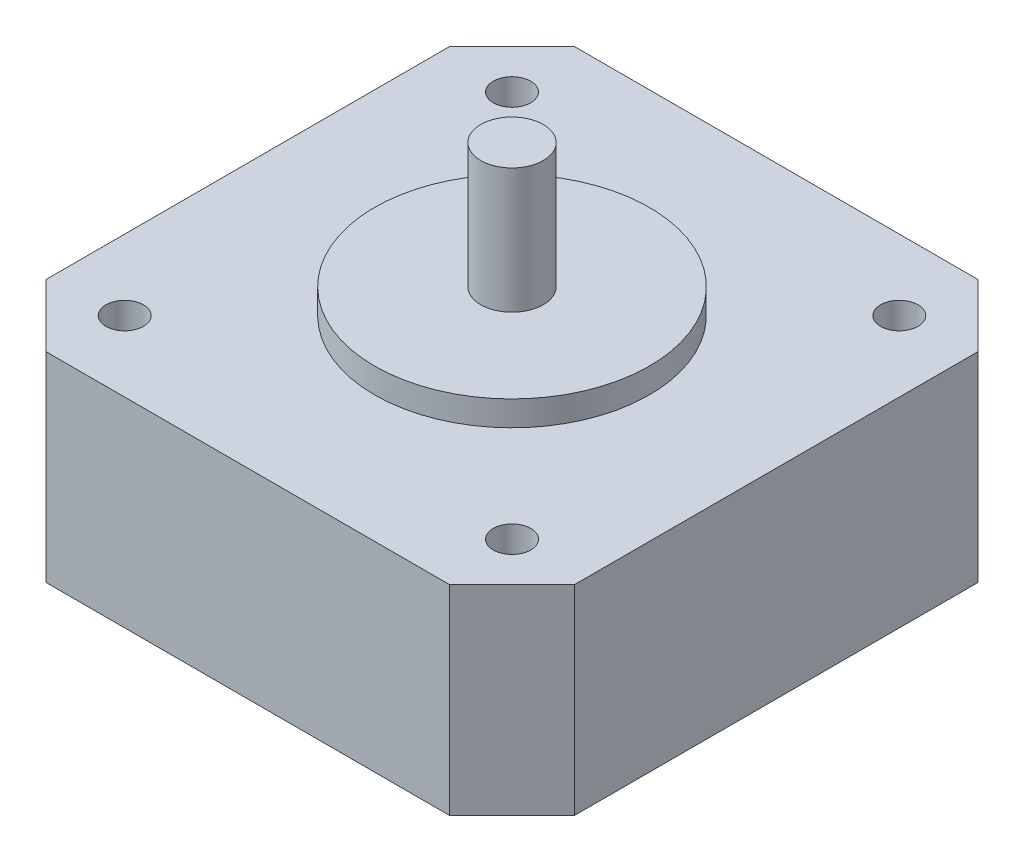
ISO-10303-21;
HEADER;
FILE_DESCRIPTION(('STEP AP214'),'2;1');
FILE_NAME('part.step','',(''),(''),'','','');
FILE_SCHEMA(('AUTOMOTIVE_DESIGN { 1 0 10303 214 1 1 1 1 }'));
ENDSEC;
DATA;
#1=APPLICATION_CONTEXT('core data for automotive mechanical design processes');
#2=APPLICATION_PROTOCOL_DEFINITION('international standard','automotive_design',2000,#1);
#3=PRODUCT_CONTEXT('',#1,'mechanical');
#4=PRODUCT('Part','Part','',(#3));
#5=PRODUCT_RELATED_PRODUCT_CATEGORY('part','',(#4));
#6=PRODUCT_DEFINITION_FORMATION('','',#4);
#7=PRODUCT_DEFINITION_CONTEXT('part definition',#1,'design');
#8=PRODUCT_DEFINITION('design','',#6,#7);
#9=PRODUCT_DEFINITION_SHAPE('','',#8);
#10=(LENGTH_UNIT() NAMED_UNIT(*) SI_UNIT(.MILLI.,.METRE.));
#11=(NAMED_UNIT(*) PLANE_ANGLE_UNIT() SI_UNIT($,.RADIAN.));
#12=(NAMED_UNIT(*) SI_UNIT($,.STERADIAN.) SOLID_ANGLE_UNIT());
#13=UNCERTAINTY_MEASURE_WITH_UNIT(LENGTH_MEASURE(1.E-05),#10,'distance_accuracy_value','');
#14=(GEOMETRIC_REPRESENTATION_CONTEXT(3) GLOBAL_UNCERTAINTY_ASSIGNED_CONTEXT((#13)) GLOBAL_UNIT_ASSIGNED_CONTEXT((#10,
#11,#12)) REPRESENTATION_CONTEXT('',''));
#15=CARTESIAN_POINT('',(0.,0.,0.));
#16=DIRECTION('',(0.,0.,1.));
#17=DIRECTION('',(1.,0.,0.));
#18=AXIS2_PLACEMENT_3D('',#15,#16,#17);
#19=CARTESIAN_POINT('',(-21.15,-45.9,-21.15));
#20=DIRECTION('',(0.,0.,-1.));
#21=DIRECTION('',(-1.,0.,0.));
#22=AXIS2_PLACEMENT_3D('',#19,#20,#21);
#23=PLANE('',#22);
#24=DIRECTION('',(1.,0.,0.));
#25=VECTOR('',#24,1.);
#26=CARTESIAN_POINT('',(-21.15,-61.9,-21.15));
#27=LINE('',#26,#25);
#28=CARTESIAN_POINT('',(-16.15,-61.9,-21.15));
#29=VERTEX_POINT('',#28);
#30=CARTESIAN_POINT('',(16.1500000000001,-61.9,-21.15));
#31=VERTEX_POINT('',#30);
#32=EDGE_CURVE('E178',#29,#31,#27,.T.);
#33=ORIENTED_EDGE('',*,*,#32,.F.);
#34=DIRECTION('',(0.,1.,0.));
#35=VECTOR('',#34,1.);
#36=CARTESIAN_POINT('',(-16.15,-45.9,-21.15));
#37=LINE('',#36,#35);
#38=CARTESIAN_POINT('',(-16.15,-45.9,-21.15));
#39=VERTEX_POINT('',#38);
#40=EDGE_CURVE('E43',#29,#39,#37,.T.);
#41=ORIENTED_EDGE('',*,*,#40,.T.);
#42=DIRECTION('',(1.,0.,0.));
#43=VECTOR('',#42,1.);
#44=CARTESIAN_POINT('',(-21.15,-45.9,-21.15));
#45=LINE('',#44,#43);
#46=CARTESIAN_POINT('',(16.1500000000001,-45.9,-21.15));
#47=VERTEX_POINT('',#46);
#48=EDGE_CURVE('E173',#39,#47,#45,.T.);
#49=ORIENTED_EDGE('',*,*,#48,.T.);
#50=DIRECTION('',(0.,-1.,0.));
#51=VECTOR('',#50,1.);
#52=CARTESIAN_POINT('',(16.1500000000001,-45.9,-21.15));
#53=LINE('',#52,#51);
#54=EDGE_CURVE('E156',#47,#31,#53,.T.);
#55=ORIENTED_EDGE('',*,*,#54,.T.);
#56=EDGE_LOOP('',(#33,#41,#49,#55));
#57=FACE_BOUND('',#56,.T.);
#58=ADVANCED_FACE('F38',(#57),#23,.T.);
#59=CARTESIAN_POINT('',(-21.15,-45.9,21.15));
#60=DIRECTION('',(-1.,0.,0.));
#61=DIRECTION('',(0.,0.,1.));
#62=AXIS2_PLACEMENT_3D('',#59,#60,#61);
#63=PLANE('',#62);
#64=DIRECTION('',(0.,0.,-1.));
#65=VECTOR('',#64,1.);
#66=CARTESIAN_POINT('',(-21.15,-61.9,21.15));
#67=LINE('',#66,#65);
#68=CARTESIAN_POINT('',(-21.15,-61.9,16.15));
#69=VERTEX_POINT('',#68);
#70=CARTESIAN_POINT('',(-21.15,-61.9,-16.1500000000001));
#71=VERTEX_POINT('',#70);
#72=EDGE_CURVE('E127',#69,#71,#67,.T.);
#73=ORIENTED_EDGE('',*,*,#72,.F.);
#74=DIRECTION('',(0.,1.,0.));
#75=VECTOR('',#74,1.);
#76=CARTESIAN_POINT('',(-21.15,-45.9,16.15));
#77=LINE('',#76,#75);
#78=CARTESIAN_POINT('',(-21.15,-45.9,16.15));
#79=VERTEX_POINT('',#78);
#80=EDGE_CURVE('E145',#69,#79,#77,.T.);
#81=ORIENTED_EDGE('',*,*,#80,.T.);
#82=DIRECTION('',(0.,0.,-1.));
#83=VECTOR('',#82,1.);
#84=CARTESIAN_POINT('',(-21.15,-45.9,21.15));
#85=LINE('',#84,#83);
#86=CARTESIAN_POINT('',(-21.15,-45.9,-16.1500000000001));
#87=VERTEX_POINT('',#86);
#88=EDGE_CURVE('E130',#79,#87,#85,.T.);
#89=ORIENTED_EDGE('',*,*,#88,.T.);
#90=DIRECTION('',(0.,-1.,0.));
#91=VECTOR('',#90,1.);
#92=CARTESIAN_POINT('',(-21.15,-45.9,-16.1500000000001));
#93=LINE('',#92,#91);
#94=EDGE_CURVE('E142',#87,#71,#93,.T.);
#95=ORIENTED_EDGE('',*,*,#94,.T.);
#96=EDGE_LOOP('',(#73,#81,#89,#95));
#97=FACE_BOUND('',#96,.T.);
#98=ADVANCED_FACE('F237',(#97),#63,.T.);
#99=CARTESIAN_POINT('',(21.15,-45.9,21.15));
#100=DIRECTION('',(0.,0.,1.));
#101=DIRECTION('',(1.,0.,0.));
#102=AXIS2_PLACEMENT_3D('',#99,#100,#101);
#103=PLANE('',#102);
#104=DIRECTION('',(-1.,0.,0.));
#105=VECTOR('',#104,1.);
#106=CARTESIAN_POINT('',(21.15,-45.9,21.15));
#107=LINE('',#106,#105);
#108=CARTESIAN_POINT('',(16.15,-45.9,21.15));
#109=VERTEX_POINT('',#108);
#110=CARTESIAN_POINT('',(-16.1500000000001,-45.9,21.15));
#111=VERTEX_POINT('',#110);
#112=EDGE_CURVE('E135',#109,#111,#107,.T.);
#113=ORIENTED_EDGE('',*,*,#112,.T.);
#114=DIRECTION('',(0.,-1.,0.));
#115=VECTOR('',#114,1.);
#116=CARTESIAN_POINT('',(-16.1500000000001,-45.9,21.15));
#117=LINE('',#116,#115);
#118=CARTESIAN_POINT('',(-16.1500000000001,-61.9,21.15));
#119=VERTEX_POINT('',#118);
#120=EDGE_CURVE('E126',#111,#119,#117,.T.);
#121=ORIENTED_EDGE('',*,*,#120,.T.);
#122=DIRECTION('',(-1.,0.,0.));
#123=VECTOR('',#122,1.);
#124=CARTESIAN_POINT('',(21.15,-61.9,21.15));
#125=LINE('',#124,#123);
#126=CARTESIAN_POINT('',(16.15,-61.9,21.15));
#127=VERTEX_POINT('',#126);
#128=EDGE_CURVE('E111',#127,#119,#125,.T.);
#129=ORIENTED_EDGE('',*,*,#128,.F.);
#130=DIRECTION('',(0.,1.,0.));
#131=VECTOR('',#130,1.);
#132=CARTESIAN_POINT('',(16.15,-45.9,21.15));
#133=LINE('',#132,#131);
#134=EDGE_CURVE('E124',#127,#109,#133,.T.);
#135=ORIENTED_EDGE('',*,*,#134,.T.);
#136=EDGE_LOOP('',(#113,#121,#129,#135));
#137=FACE_BOUND('',#136,.T.);
#138=ADVANCED_FACE('F123',(#137),#103,.T.);
#139=CARTESIAN_POINT('',(21.15,-45.9,-21.15));
#140=DIRECTION('',(1.,0.,0.));
#141=DIRECTION('',(0.,0.,-1.));
#142=AXIS2_PLACEMENT_3D('',#139,#140,#141);
#143=PLANE('',#142);
#144=DIRECTION('',(0.,0.,1.));
#145=VECTOR('',#144,1.);
#146=CARTESIAN_POINT('',(21.15,-45.9,-21.15));
#147=LINE('',#146,#145);
#148=CARTESIAN_POINT('',(21.15,-45.9,-16.15));
#149=VERTEX_POINT('',#148);
#150=CARTESIAN_POINT('',(21.15,-45.9,16.1500000000001));
#151=VERTEX_POINT('',#150);
#152=EDGE_CURVE('E175',#149,#151,#147,.T.);
#153=ORIENTED_EDGE('',*,*,#152,.T.);
#154=DIRECTION('',(0.,-1.,0.));
#155=VECTOR('',#154,1.);
#156=CARTESIAN_POINT('',(21.15,-45.9,16.1500000000001));
#157=LINE('',#156,#155);
#158=CARTESIAN_POINT('',(21.15,-61.9,16.1500000000001));
#159=VERTEX_POINT('',#158);
#160=EDGE_CURVE('E155',#151,#159,#157,.T.);
#161=ORIENTED_EDGE('',*,*,#160,.T.);
#162=DIRECTION('',(0.,0.,1.));
#163=VECTOR('',#162,1.);
#164=CARTESIAN_POINT('',(21.15,-61.9,-21.15));
#165=LINE('',#164,#163);
#166=CARTESIAN_POINT('',(21.15,-61.9,-16.15));
#167=VERTEX_POINT('',#166);
#168=EDGE_CURVE('E112',#167,#159,#165,.T.);
#169=ORIENTED_EDGE('',*,*,#168,.F.);
#170=DIRECTION('',(0.,1.,0.));
#171=VECTOR('',#170,1.);
#172=CARTESIAN_POINT('',(21.15,-45.9,-16.15));
#173=LINE('',#172,#171);
#174=EDGE_CURVE('E63',#167,#149,#173,.T.);
#175=ORIENTED_EDGE('',*,*,#174,.T.);
#176=EDGE_LOOP('',(#153,#161,#169,#175));
#177=FACE_BOUND('',#176,.T.);
#178=ADVANCED_FACE('F246',(#177),#143,.T.);
#179=CARTESIAN_POINT('',(0.,-45.9,0.));
#180=DIRECTION('',(0.,-1.,0.));
#181=DIRECTION('',(0.,0.,-1.));
#182=AXIS2_PLACEMENT_3D('',#179,#180,#181);
#183=PLANE('',#182);
#184=CARTESIAN_POINT('',(15.5,-45.9,-15.5));
#185=DIRECTION('',(0.,1.,0.));
#186=DIRECTION('',(0.,0.,1.));
#187=AXIS2_PLACEMENT_3D('',#184,#185,#186);
#188=CIRCLE('',#187,1.5);
#189=CARTESIAN_POINT('',(15.5,-45.9,-14.));
#190=VERTEX_POINT('',#189);
#191=EDGE_CURVE('E192',#190,#190,#188,.T.);
#192=ORIENTED_EDGE('',*,*,#191,.F.);
#193=EDGE_LOOP('',(#192));
#194=FACE_BOUND('',#193,.T.);
#195=CARTESIAN_POINT('',(15.5,-45.9,15.5));
#196=DIRECTION('',(0.,1.,0.));
#197=DIRECTION('',(0.,0.,1.));
#198=AXIS2_PLACEMENT_3D('',#195,#196,#197);
#199=CIRCLE('',#198,1.5);
#200=CARTESIAN_POINT('',(15.5,-45.9,17.));
#201=VERTEX_POINT('',#200);
#202=EDGE_CURVE('E199',#201,#201,#199,.T.);
#203=ORIENTED_EDGE('',*,*,#202,.F.);
#204=EDGE_LOOP('',(#203));
#205=FACE_BOUND('',#204,.T.);
#206=CARTESIAN_POINT('',(-15.5,-45.9,15.5));
#207=DIRECTION('',(0.,1.,0.));
#208=DIRECTION('',(0.,0.,1.));
#209=AXIS2_PLACEMENT_3D('',#206,#207,#208);
#210=CIRCLE('',#209,1.5);
#211=CARTESIAN_POINT('',(-15.5,-45.9,17.));
#212=VERTEX_POINT('',#211);
#213=EDGE_CURVE('E205',#212,#212,#210,.T.);
#214=ORIENTED_EDGE('',*,*,#213,.F.);
#215=EDGE_LOOP('',(#214));
#216=FACE_BOUND('',#215,.T.);
#217=CARTESIAN_POINT('',(-15.5,-45.9,-15.5));
#218=DIRECTION('',(0.,1.,0.));
#219=DIRECTION('',(0.,0.,1.));
#220=AXIS2_PLACEMENT_3D('',#217,#218,#219);
#221=CIRCLE('',#220,1.5);
#222=CARTESIAN_POINT('',(-15.5,-45.9,-14.));
#223=VERTEX_POINT('',#222);
#224=EDGE_CURVE('E185',#223,#223,#221,.T.);
#225=ORIENTED_EDGE('',*,*,#224,.F.);
#226=EDGE_LOOP('',(#225));
#227=FACE_BOUND('',#226,.T.);
#228=CARTESIAN_POINT('',(0.,-45.9,0.));
#229=DIRECTION('',(0.,1.,0.));
#230=DIRECTION('',(0.,0.,1.));
#231=AXIS2_PLACEMENT_3D('',#228,#229,#230);
#232=CIRCLE('',#231,11.);
#233=CARTESIAN_POINT('',(0.,-45.9,11.));
#234=VERTEX_POINT('',#233);
#235=EDGE_CURVE('E48',#234,#234,#232,.T.);
#236=ORIENTED_EDGE('',*,*,#235,.F.);
#237=EDGE_LOOP('',(#236));
#238=FACE_BOUND('',#237,.T.);
#239=ORIENTED_EDGE('',*,*,#88,.F.);
#240=DIRECTION('',(-0.707106781186543,0.,-0.707106781186552));
#241=VECTOR('',#240,1.);
#242=CARTESIAN_POINT('',(-16.1500000000001,-45.9,21.15));
#243=LINE('',#242,#241);
#244=EDGE_CURVE('E152',#79,#111,#243,.F.);
#245=ORIENTED_EDGE('',*,*,#244,.T.);
#246=ORIENTED_EDGE('',*,*,#112,.F.);
#247=DIRECTION('',(-0.707106781186552,0.,0.707106781186543));
#248=VECTOR('',#247,1.);
#249=CARTESIAN_POINT('',(21.15,-45.9,16.1500000000001));
#250=LINE('',#249,#248);
#251=EDGE_CURVE('E56',#109,#151,#250,.F.);
#252=ORIENTED_EDGE('',*,*,#251,.T.);
#253=ORIENTED_EDGE('',*,*,#152,.F.);
#254=DIRECTION('',(0.707106781186543,0.,0.707106781186552));
#255=VECTOR('',#254,1.);
#256=CARTESIAN_POINT('',(16.1500000000001,-45.9,-21.15));
#257=LINE('',#256,#255);
#258=EDGE_CURVE('E147',#149,#47,#257,.F.);
#259=ORIENTED_EDGE('',*,*,#258,.T.);
#260=ORIENTED_EDGE('',*,*,#48,.F.);
#261=DIRECTION('',(0.707106781186552,0.,-0.707106781186543));
#262=VECTOR('',#261,1.);
#263=CARTESIAN_POINT('',(-21.15,-45.9,-16.1500000000001));
#264=LINE('',#263,#262);
#265=EDGE_CURVE('E149',#39,#87,#264,.F.);
#266=ORIENTED_EDGE('',*,*,#265,.T.);
#267=EDGE_LOOP('',(#239,#245,#246,#252,#253,#259,#260,#266));
#268=FACE_BOUND('',#267,.T.);
#269=ADVANCED_FACE('F272',(#194,#205,#216,#227,#238,#268),#183,.F.);
#270=CARTESIAN_POINT('',(0.,-61.9,0.));
#271=DIRECTION('',(0.,-1.,0.));
#272=DIRECTION('',(0.,0.,-1.));
#273=AXIS2_PLACEMENT_3D('',#270,#271,#272);
#274=PLANE('',#273);
#275=ORIENTED_EDGE('',*,*,#128,.T.);
#276=DIRECTION('',(0.707106781186543,0.,0.707106781186552));
#277=VECTOR('',#276,1.);
#278=CARTESIAN_POINT('',(-18.6500000000001,-61.9,18.6499999999999));
#279=LINE('',#278,#277);
#280=EDGE_CURVE('E117',#119,#69,#279,.F.);
#281=ORIENTED_EDGE('',*,*,#280,.T.);
#282=ORIENTED_EDGE('',*,*,#72,.T.);
#283=DIRECTION('',(-0.707106781186552,0.,0.707106781186543));
#284=VECTOR('',#283,1.);
#285=CARTESIAN_POINT('',(-18.6499999999999,-61.9,-18.6500000000001));
#286=LINE('',#285,#284);
#287=EDGE_CURVE('E118',#71,#29,#286,.F.);
#288=ORIENTED_EDGE('',*,*,#287,.T.);
#289=ORIENTED_EDGE('',*,*,#32,.T.);
#290=DIRECTION('',(-0.707106781186543,0.,-0.707106781186552));
#291=VECTOR('',#290,1.);
#292=CARTESIAN_POINT('',(18.6500000000001,-61.9,-18.6499999999999));
#293=LINE('',#292,#291);
#294=EDGE_CURVE('E132',#31,#167,#293,.F.);
#295=ORIENTED_EDGE('',*,*,#294,.T.);
#296=ORIENTED_EDGE('',*,*,#168,.T.);
#297=DIRECTION('',(0.707106781186552,0.,-0.707106781186543));
#298=VECTOR('',#297,1.);
#299=CARTESIAN_POINT('',(18.6499999999999,-61.9,18.6500000000001));
#300=LINE('',#299,#298);
#301=EDGE_CURVE('E108',#159,#127,#300,.F.);
#302=ORIENTED_EDGE('',*,*,#301,.T.);
#303=EDGE_LOOP('',(#275,#281,#282,#288,#289,#295,#296,#302));
#304=FACE_BOUND('',#303,.T.);
#305=ADVANCED_FACE('F110',(#304),#274,.T.);
#306=CARTESIAN_POINT('',(-16.1500000000001,-45.9,21.15));
#307=DIRECTION('',(0.707106781186552,0.,-0.707106781186543));
#308=DIRECTION('',(0.,-1.,0.));
#309=AXIS2_PLACEMENT_3D('',#306,#307,#308);
#310=PLANE('',#309);
#311=ORIENTED_EDGE('',*,*,#244,.F.);
#312=ORIENTED_EDGE('',*,*,#80,.F.);
#313=ORIENTED_EDGE('',*,*,#280,.F.);
#314=ORIENTED_EDGE('',*,*,#120,.F.);
#315=EDGE_LOOP('',(#311,#312,#313,#314));
#316=FACE_BOUND('',#315,.T.);
#317=ADVANCED_FACE('F249',(#316),#310,.F.);
#318=CARTESIAN_POINT('',(21.15,-45.9,16.1500000000001));
#319=DIRECTION('',(-0.707106781186543,0.,-0.707106781186552));
#320=DIRECTION('',(0.,-1.,0.));
#321=AXIS2_PLACEMENT_3D('',#318,#319,#320);
#322=PLANE('',#321);
#323=ORIENTED_EDGE('',*,*,#251,.F.);
#324=ORIENTED_EDGE('',*,*,#134,.F.);
#325=ORIENTED_EDGE('',*,*,#301,.F.);
#326=ORIENTED_EDGE('',*,*,#160,.F.);
#327=EDGE_LOOP('',(#323,#324,#325,#326));
#328=FACE_BOUND('',#327,.T.);
#329=ADVANCED_FACE('F129',(#328),#322,.F.);
#330=CARTESIAN_POINT('',(-21.15,-45.9,-16.1500000000001));
#331=DIRECTION('',(0.707106781186543,0.,0.707106781186552));
#332=DIRECTION('',(0.,-1.,0.));
#333=AXIS2_PLACEMENT_3D('',#330,#331,#332);
#334=PLANE('',#333);
#335=ORIENTED_EDGE('',*,*,#265,.F.);
#336=ORIENTED_EDGE('',*,*,#40,.F.);
#337=ORIENTED_EDGE('',*,*,#287,.F.);
#338=ORIENTED_EDGE('',*,*,#94,.F.);
#339=EDGE_LOOP('',(#335,#336,#337,#338));
#340=FACE_BOUND('',#339,.T.);
#341=ADVANCED_FACE('F260',(#340),#334,.F.);
#342=CARTESIAN_POINT('',(16.1500000000001,-45.9,-21.15));
#343=DIRECTION('',(-0.707106781186552,0.,0.707106781186543));
#344=DIRECTION('',(0.,-1.,0.));
#345=AXIS2_PLACEMENT_3D('',#342,#343,#344);
#346=PLANE('',#345);
#347=ORIENTED_EDGE('',*,*,#258,.F.);
#348=ORIENTED_EDGE('',*,*,#174,.F.);
#349=ORIENTED_EDGE('',*,*,#294,.F.);
#350=ORIENTED_EDGE('',*,*,#54,.F.);
#351=EDGE_LOOP('',(#347,#348,#349,#350));
#352=FACE_BOUND('',#351,.T.);
#353=ADVANCED_FACE('F41',(#352),#346,.F.);
#354=CARTESIAN_POINT('',(0.,-43.9,0.));
#355=DIRECTION('',(0.,-1.,0.));
#356=DIRECTION('',(0.,0.,-1.));
#357=AXIS2_PLACEMENT_3D('',#354,#355,#356);
#358=CYLINDRICAL_SURFACE('',#357,11.);
#359=CARTESIAN_POINT('',(0.,-43.9,0.));
#360=DIRECTION('',(0.,1.,0.));
#361=DIRECTION('',(0.,0.,1.));
#362=AXIS2_PLACEMENT_3D('',#359,#360,#361);
#363=CIRCLE('',#362,11.);
#364=CARTESIAN_POINT('',(0.,-43.9,11.));
#365=VERTEX_POINT('',#364);
#366=EDGE_CURVE('E171',#365,#365,#363,.T.);
#367=ORIENTED_EDGE('',*,*,#366,.F.);
#368=EDGE_LOOP('',(#367));
#369=FACE_BOUND('',#368,.T.);
#370=ORIENTED_EDGE('',*,*,#235,.T.);
#371=EDGE_LOOP('',(#370));
#372=FACE_BOUND('',#371,.T.);
#373=ADVANCED_FACE('F225',(#369,#372),#358,.T.);
#374=CARTESIAN_POINT('',(0.,-43.9,0.));
#375=DIRECTION('',(0.,1.,0.));
#376=DIRECTION('',(0.,0.,1.));
#377=AXIS2_PLACEMENT_3D('',#374,#375,#376);
#378=PLANE('',#377);
#379=CARTESIAN_POINT('',(0.,-43.9,0.));
#380=DIRECTION('',(0.,1.,0.));
#381=DIRECTION('',(0.,0.,1.));
#382=AXIS2_PLACEMENT_3D('',#379,#380,#381);
#383=CIRCLE('',#382,2.5);
#384=CARTESIAN_POINT('',(0.,-43.9,2.5));
#385=VERTEX_POINT('',#384);
#386=EDGE_CURVE('E11',#385,#385,#383,.T.);
#387=ORIENTED_EDGE('',*,*,#386,.F.);
#388=EDGE_LOOP('',(#387));
#389=FACE_BOUND('',#388,.T.);
#390=ORIENTED_EDGE('',*,*,#366,.T.);
#391=EDGE_LOOP('',(#390));
#392=FACE_BOUND('',#391,.T.);
#393=ADVANCED_FACE('F222',(#389,#392),#378,.T.);
#394=CARTESIAN_POINT('',(-15.5,-50.9,-15.5));
#395=DIRECTION('',(0.,1.,0.));
#396=DIRECTION('',(0.,0.,1.));
#397=AXIS2_PLACEMENT_3D('',#394,#395,#396);
#398=CYLINDRICAL_SURFACE('',#397,1.5);
#399=CARTESIAN_POINT('',(-15.5,-50.9,-15.5));
#400=DIRECTION('',(0.,1.,0.));
#401=DIRECTION('',(0.,0.,1.));
#402=AXIS2_PLACEMENT_3D('',#399,#400,#401);
#403=CIRCLE('',#402,1.5);
#404=CARTESIAN_POINT('',(-15.5,-50.9,-14.));
#405=VERTEX_POINT('',#404);
#406=EDGE_CURVE('E181',#405,#405,#403,.T.);
#407=ORIENTED_EDGE('',*,*,#406,.F.);
#408=EDGE_LOOP('',(#407));
#409=FACE_BOUND('',#408,.T.);
#410=ORIENTED_EDGE('',*,*,#224,.T.);
#411=EDGE_LOOP('',(#410));
#412=FACE_BOUND('',#411,.T.);
#413=ADVANCED_FACE('F224',(#409,#412),#398,.F.);
#414=CARTESIAN_POINT('',(0.,-50.9,0.));
#415=DIRECTION('',(0.,1.,0.));
#416=DIRECTION('',(0.,0.,1.));
#417=AXIS2_PLACEMENT_3D('',#414,#415,#416);
#418=PLANE('',#417);
#419=ORIENTED_EDGE('',*,*,#406,.T.);
#420=EDGE_LOOP('',(#419));
#421=FACE_BOUND('',#420,.T.);
#422=ADVANCED_FACE('F231',(#421),#418,.T.);
#423=CARTESIAN_POINT('',(-15.5,-50.9,15.5));
#424=DIRECTION('',(0.,1.,0.));
#425=DIRECTION('',(0.,0.,1.));
#426=AXIS2_PLACEMENT_3D('',#423,#424,#425);
#427=CYLINDRICAL_SURFACE('',#426,1.5);
#428=CARTESIAN_POINT('',(-15.5,-50.9,15.5));
#429=DIRECTION('',(0.,1.,0.));
#430=DIRECTION('',(0.,0.,1.));
#431=AXIS2_PLACEMENT_3D('',#428,#429,#430);
#432=CIRCLE('',#431,1.5);
#433=CARTESIAN_POINT('',(-15.5,-50.9,17.));
#434=VERTEX_POINT('',#433);
#435=EDGE_CURVE('E190',#434,#434,#432,.T.);
#436=ORIENTED_EDGE('',*,*,#435,.F.);
#437=EDGE_LOOP('',(#436));
#438=FACE_BOUND('',#437,.T.);
#439=ORIENTED_EDGE('',*,*,#213,.T.);
#440=EDGE_LOOP('',(#439));
#441=FACE_BOUND('',#440,.T.);
#442=ADVANCED_FACE('F338',(#438,#441),#427,.F.);
#443=CARTESIAN_POINT('',(0.,-50.9,0.));
#444=DIRECTION('',(0.,1.,0.));
#445=DIRECTION('',(0.,0.,1.));
#446=AXIS2_PLACEMENT_3D('',#443,#444,#445);
#447=PLANE('',#446);
#448=ORIENTED_EDGE('',*,*,#435,.T.);
#449=EDGE_LOOP('',(#448));
#450=FACE_BOUND('',#449,.T.);
#451=ADVANCED_FACE('F347',(#450),#447,.T.);
#452=CARTESIAN_POINT('',(15.5,-50.9,15.5));
#453=DIRECTION('',(0.,1.,0.));
#454=DIRECTION('',(0.,0.,1.));
#455=AXIS2_PLACEMENT_3D('',#452,#453,#454);
#456=CYLINDRICAL_SURFACE('',#455,1.5);
#457=CARTESIAN_POINT('',(15.5,-50.9,15.5));
#458=DIRECTION('',(0.,1.,0.));
#459=DIRECTION('',(0.,0.,1.));
#460=AXIS2_PLACEMENT_3D('',#457,#458,#459);
#461=CIRCLE('',#460,1.5);
#462=CARTESIAN_POINT('',(15.5,-50.9,17.));
#463=VERTEX_POINT('',#462);
#464=EDGE_CURVE('E202',#463,#463,#461,.T.);
#465=ORIENTED_EDGE('',*,*,#464,.F.);
#466=EDGE_LOOP('',(#465));
#467=FACE_BOUND('',#466,.T.);
#468=ORIENTED_EDGE('',*,*,#202,.T.);
#469=EDGE_LOOP('',(#468));
#470=FACE_BOUND('',#469,.T.);
#471=ADVANCED_FACE('F357',(#467,#470),#456,.F.);
#472=CARTESIAN_POINT('',(0.,-50.9,0.));
#473=DIRECTION('',(0.,1.,0.));
#474=DIRECTION('',(0.,0.,1.));
#475=AXIS2_PLACEMENT_3D('',#472,#473,#474);
#476=PLANE('',#475);
#477=ORIENTED_EDGE('',*,*,#464,.T.);
#478=EDGE_LOOP('',(#477));
#479=FACE_BOUND('',#478,.T.);
#480=ADVANCED_FACE('F367',(#479),#476,.T.);
#481=CARTESIAN_POINT('',(15.5,-50.9,-15.5));
#482=DIRECTION('',(0.,1.,0.));
#483=DIRECTION('',(0.,0.,1.));
#484=AXIS2_PLACEMENT_3D('',#481,#482,#483);
#485=CYLINDRICAL_SURFACE('',#484,1.5);
#486=CARTESIAN_POINT('',(15.5,-50.9,-15.5));
#487=DIRECTION('',(0.,1.,0.));
#488=DIRECTION('',(0.,0.,1.));
#489=AXIS2_PLACEMENT_3D('',#486,#487,#488);
#490=CIRCLE('',#489,1.5);
#491=CARTESIAN_POINT('',(15.5,-50.9,-14.));
#492=VERTEX_POINT('',#491);
#493=EDGE_CURVE('E195',#492,#492,#490,.T.);
#494=ORIENTED_EDGE('',*,*,#493,.F.);
#495=EDGE_LOOP('',(#494));
#496=FACE_BOUND('',#495,.T.);
#497=ORIENTED_EDGE('',*,*,#191,.T.);
#498=EDGE_LOOP('',(#497));
#499=FACE_BOUND('',#498,.T.);
#500=ADVANCED_FACE('F377',(#496,#499),#485,.F.);
#501=CARTESIAN_POINT('',(0.,-50.9,0.));
#502=DIRECTION('',(0.,1.,0.));
#503=DIRECTION('',(0.,0.,1.));
#504=AXIS2_PLACEMENT_3D('',#501,#502,#503);
#505=PLANE('',#504);
#506=ORIENTED_EDGE('',*,*,#493,.T.);
#507=EDGE_LOOP('',(#506));
#508=FACE_BOUND('',#507,.T.);
#509=ADVANCED_FACE('F218',(#508),#505,.T.);
#510=CARTESIAN_POINT('',(0.,-33.9,0.));
#511=DIRECTION('',(0.,-1.,0.));
#512=DIRECTION('',(0.,0.,-1.));
#513=AXIS2_PLACEMENT_3D('',#510,#511,#512);
#514=CYLINDRICAL_SURFACE('',#513,2.5);
#515=CARTESIAN_POINT('',(0.,-33.9,0.));
#516=DIRECTION('',(0.,1.,0.));
#517=DIRECTION('',(0.,0.,1.));
#518=AXIS2_PLACEMENT_3D('',#515,#516,#517);
#519=CIRCLE('',#518,2.5);
#520=CARTESIAN_POINT('',(0.,-33.9,2.5));
#521=VERTEX_POINT('',#520);
#522=EDGE_CURVE('E196',#521,#521,#519,.T.);
#523=ORIENTED_EDGE('',*,*,#522,.F.);
#524=EDGE_LOOP('',(#523));
#525=FACE_BOUND('',#524,.T.);
#526=ORIENTED_EDGE('',*,*,#386,.T.);
#527=EDGE_LOOP('',(#526));
#528=FACE_BOUND('',#527,.T.);
#529=ADVANCED_FACE('F215',(#525,#528),#514,.T.);
#530=CARTESIAN_POINT('',(0.,-33.9,0.));
#531=DIRECTION('',(0.,1.,0.));
#532=DIRECTION('',(0.,0.,1.));
#533=AXIS2_PLACEMENT_3D('',#530,#531,#532);
#534=PLANE('',#533);
#535=ORIENTED_EDGE('',*,*,#522,.T.);
#536=EDGE_LOOP('',(#535));
#537=FACE_BOUND('',#536,.T.);
#538=ADVANCED_FACE('F213',(#537),#534,.T.);
#539=CLOSED_SHELL('',(#58,#98,#138,#178,#269,#305,#317,#329,#341,#353,#373,#393,#413,#422,#442,
#451,#471,#480,#500,#509,#529,#538));
#540=MANIFOLD_SOLID_BREP('B2',#539);
#541=ADVANCED_BREP_SHAPE_REPRESENTATION('',(#18,#540),#14);
#542=SHAPE_DEFINITION_REPRESENTATION(#9,#541);
ENDSEC;
END-ISO-10303-21;
